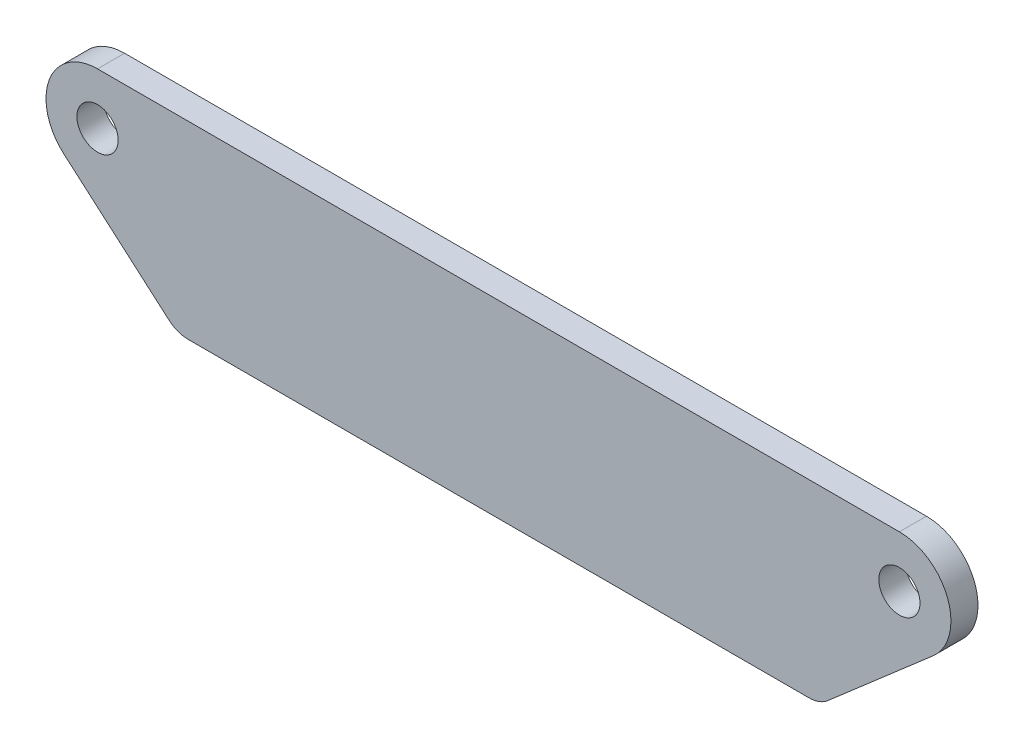
ISO-10303-21;
HEADER;
FILE_DESCRIPTION(('STEP AP214'),'2;1');
FILE_NAME('part.step','',(''),(''),'','','');
FILE_SCHEMA(('AUTOMOTIVE_DESIGN { 1 0 10303 214 1 1 1 1 }'));
ENDSEC;
DATA;
#1=APPLICATION_CONTEXT('core data for automotive mechanical design processes');
#2=APPLICATION_PROTOCOL_DEFINITION('international standard','automotive_design',2000,#1);
#3=PRODUCT_CONTEXT('',#1,'mechanical');
#4=PRODUCT('Part','Part','',(#3));
#5=PRODUCT_RELATED_PRODUCT_CATEGORY('part','',(#4));
#6=PRODUCT_DEFINITION_FORMATION('','',#4);
#7=PRODUCT_DEFINITION_CONTEXT('part definition',#1,'design');
#8=PRODUCT_DEFINITION('design','',#6,#7);
#9=PRODUCT_DEFINITION_SHAPE('','',#8);
#10=(LENGTH_UNIT() NAMED_UNIT(*) SI_UNIT(.MILLI.,.METRE.));
#11=(NAMED_UNIT(*) PLANE_ANGLE_UNIT() SI_UNIT($,.RADIAN.));
#12=(NAMED_UNIT(*) SI_UNIT($,.STERADIAN.) SOLID_ANGLE_UNIT());
#13=UNCERTAINTY_MEASURE_WITH_UNIT(LENGTH_MEASURE(1.E-05),#10,'distance_accuracy_value','');
#14=(GEOMETRIC_REPRESENTATION_CONTEXT(3) GLOBAL_UNCERTAINTY_ASSIGNED_CONTEXT((#13)) GLOBAL_UNIT_ASSIGNED_CONTEXT((#10,
#11,#12)) REPRESENTATION_CONTEXT('',''));
#15=CARTESIAN_POINT('',(0.,0.,0.));
#16=DIRECTION('',(0.,0.,1.));
#17=DIRECTION('',(1.,0.,0.));
#18=AXIS2_PLACEMENT_3D('',#15,#16,#17);
#19=CARTESIAN_POINT('',(0.,6.35,3.));
#20=DIRECTION('',(0.,0.,-1.));
#21=DIRECTION('',(-1.,0.,0.));
#22=AXIS2_PLACEMENT_3D('',#19,#20,#21);
#23=PLANE('',#22);
#24=CARTESIAN_POINT('',(0.,6.35,3.));
#25=DIRECTION('',(0.,0.,1.));
#26=DIRECTION('',(1.,0.,0.));
#27=AXIS2_PLACEMENT_3D('',#24,#25,#26);
#28=CIRCLE('',#27,2.286);
#29=CARTESIAN_POINT('',(2.286,6.35,3.));
#30=VERTEX_POINT('',#29);
#31=EDGE_CURVE('E133',#30,#30,#28,.T.);
#32=ORIENTED_EDGE('',*,*,#31,.F.);
#33=EDGE_LOOP('',(#32));
#34=FACE_BOUND('',#33,.T.);
#35=CARTESIAN_POINT('',(0.,6.35,3.));
#36=DIRECTION('',(0.,0.,1.));
#37=DIRECTION('',(-1.,0.,0.));
#38=AXIS2_PLACEMENT_3D('',#35,#36,#37);
#39=CIRCLE('',#38,5.715);
#40=CARTESIAN_POINT('',(0.,12.065,3.));
#41=VERTEX_POINT('',#40);
#42=CARTESIAN_POINT('',(-3.74746717388892,2.035175,3.));
#43=VERTEX_POINT('',#42);
#44=EDGE_CURVE('E144',#41,#43,#39,.T.);
#45=ORIENTED_EDGE('',*,*,#44,.T.);
#46=DIRECTION('',(0.755,-0.655724789831832,0.));
#47=VECTOR('',#46,1.);
#48=CARTESIAN_POINT('',(-3.74746717388892,2.035175,3.));
#49=LINE('',#48,#47);
#50=CARTESIAN_POINT('',(7.93611047759015,-8.112125,3.));
#51=VERTEX_POINT('',#50);
#52=EDGE_CURVE('E92',#43,#51,#49,.T.);
#53=ORIENTED_EDGE('',*,*,#52,.T.);
#54=CARTESIAN_POINT('',(10.0180366853062,-5.715,3.));
#55=DIRECTION('',(0.,0.,1.));
#56=DIRECTION('',(1.,0.,0.));
#57=AXIS2_PLACEMENT_3D('',#54,#55,#56);
#58=CIRCLE('',#57,3.175);
#59=CARTESIAN_POINT('',(10.0180366853062,-8.89,3.));
#60=VERTEX_POINT('',#59);
#61=EDGE_CURVE('E159',#51,#60,#58,.T.);
#62=ORIENTED_EDGE('',*,*,#61,.T.);
#63=DIRECTION('',(1.,0.,0.));
#64=VECTOR('',#63,1.);
#65=CARTESIAN_POINT('',(10.0180366853062,-8.89,3.));
#66=LINE('',#65,#64);
#67=CARTESIAN_POINT('',(78.8819633146938,-8.89,3.));
#68=VERTEX_POINT('',#67);
#69=EDGE_CURVE('E172',#60,#68,#66,.T.);
#70=ORIENTED_EDGE('',*,*,#69,.T.);
#71=CARTESIAN_POINT('',(78.8819633146938,-5.715,3.));
#72=DIRECTION('',(0.,0.,1.));
#73=DIRECTION('',(-1.,0.,0.));
#74=AXIS2_PLACEMENT_3D('',#71,#72,#73);
#75=CIRCLE('',#74,3.175);
#76=CARTESIAN_POINT('',(80.9638895224098,-8.112125,3.));
#77=VERTEX_POINT('',#76);
#78=EDGE_CURVE('E111',#68,#77,#75,.T.);
#79=ORIENTED_EDGE('',*,*,#78,.T.);
#80=DIRECTION('',(0.755,0.655724789831832,0.));
#81=VECTOR('',#80,1.);
#82=CARTESIAN_POINT('',(92.6474671738889,2.035175,3.));
#83=LINE('',#82,#81);
#84=CARTESIAN_POINT('',(92.6474671738889,2.035175,3.));
#85=VERTEX_POINT('',#84);
#86=EDGE_CURVE('E105',#77,#85,#83,.T.);
#87=ORIENTED_EDGE('',*,*,#86,.T.);
#88=CARTESIAN_POINT('',(88.9,6.35,3.));
#89=DIRECTION('',(0.,0.,1.));
#90=DIRECTION('',(-1.,0.,0.));
#91=AXIS2_PLACEMENT_3D('',#88,#89,#90);
#92=CIRCLE('',#91,5.715);
#93=CARTESIAN_POINT('',(88.9,12.065,3.));
#94=VERTEX_POINT('',#93);
#95=EDGE_CURVE('E109',#85,#94,#92,.T.);
#96=ORIENTED_EDGE('',*,*,#95,.T.);
#97=DIRECTION('',(-1.,0.,0.));
#98=VECTOR('',#97,1.);
#99=CARTESIAN_POINT('',(0.,12.065,3.));
#100=LINE('',#99,#98);
#101=EDGE_CURVE('E49',#94,#41,#100,.T.);
#102=ORIENTED_EDGE('',*,*,#101,.T.);
#103=EDGE_LOOP('',(#45,#53,#62,#70,#79,#87,#96,#102));
#104=FACE_BOUND('',#103,.T.);
#105=CARTESIAN_POINT('',(88.9,6.35,3.));
#106=DIRECTION('',(0.,0.,1.));
#107=DIRECTION('',(1.,0.,0.));
#108=AXIS2_PLACEMENT_3D('',#105,#106,#107);
#109=CIRCLE('',#108,2.28599999999999);
#110=CARTESIAN_POINT('',(91.186,6.35,3.));
#111=VERTEX_POINT('',#110);
#112=EDGE_CURVE('E181',#111,#111,#109,.T.);
#113=ORIENTED_EDGE('',*,*,#112,.F.);
#114=EDGE_LOOP('',(#113));
#115=FACE_BOUND('',#114,.T.);
#116=ADVANCED_FACE('F32',(#34,#104,#115),#23,.F.);
#117=CARTESIAN_POINT('',(0.,6.35,0.));
#118=DIRECTION('',(0.,0.,-1.));
#119=DIRECTION('',(-1.,0.,0.));
#120=AXIS2_PLACEMENT_3D('',#117,#118,#119);
#121=PLANE('',#120);
#122=CARTESIAN_POINT('',(0.,6.35,0.));
#123=DIRECTION('',(0.,0.,1.));
#124=DIRECTION('',(1.,0.,0.));
#125=AXIS2_PLACEMENT_3D('',#122,#123,#124);
#126=CIRCLE('',#125,2.286);
#127=CARTESIAN_POINT('',(2.286,6.35,0.));
#128=VERTEX_POINT('',#127);
#129=EDGE_CURVE('E178',#128,#128,#126,.T.);
#130=ORIENTED_EDGE('',*,*,#129,.T.);
#131=EDGE_LOOP('',(#130));
#132=FACE_BOUND('',#131,.T.);
#133=CARTESIAN_POINT('',(0.,6.35,0.));
#134=DIRECTION('',(0.,0.,1.));
#135=DIRECTION('',(-1.,0.,0.));
#136=AXIS2_PLACEMENT_3D('',#133,#134,#135);
#137=CIRCLE('',#136,5.715);
#138=CARTESIAN_POINT('',(0.,12.065,0.));
#139=VERTEX_POINT('',#138);
#140=CARTESIAN_POINT('',(-3.74746717388892,2.035175,0.));
#141=VERTEX_POINT('',#140);
#142=EDGE_CURVE('E129',#139,#141,#137,.T.);
#143=ORIENTED_EDGE('',*,*,#142,.F.);
#144=DIRECTION('',(-1.,0.,0.));
#145=VECTOR('',#144,1.);
#146=CARTESIAN_POINT('',(0.,12.065,0.));
#147=LINE('',#146,#145);
#148=CARTESIAN_POINT('',(88.9,12.065,0.));
#149=VERTEX_POINT('',#148);
#150=EDGE_CURVE('E84',#149,#139,#147,.T.);
#151=ORIENTED_EDGE('',*,*,#150,.F.);
#152=CARTESIAN_POINT('',(88.9,6.35,0.));
#153=DIRECTION('',(0.,0.,1.));
#154=DIRECTION('',(-1.,0.,0.));
#155=AXIS2_PLACEMENT_3D('',#152,#153,#154);
#156=CIRCLE('',#155,5.715);
#157=CARTESIAN_POINT('',(92.6474671738889,2.035175,0.));
#158=VERTEX_POINT('',#157);
#159=EDGE_CURVE('E78',#158,#149,#156,.T.);
#160=ORIENTED_EDGE('',*,*,#159,.F.);
#161=DIRECTION('',(0.755,0.655724789831832,0.));
#162=VECTOR('',#161,1.);
#163=CARTESIAN_POINT('',(92.6474671738889,2.035175,0.));
#164=LINE('',#163,#162);
#165=CARTESIAN_POINT('',(80.9638895224098,-8.112125,0.));
#166=VERTEX_POINT('',#165);
#167=EDGE_CURVE('E119',#166,#158,#164,.T.);
#168=ORIENTED_EDGE('',*,*,#167,.F.);
#169=CARTESIAN_POINT('',(78.8819633146938,-5.715,0.));
#170=DIRECTION('',(0.,0.,1.));
#171=DIRECTION('',(-1.,0.,0.));
#172=AXIS2_PLACEMENT_3D('',#169,#170,#171);
#173=CIRCLE('',#172,3.175);
#174=CARTESIAN_POINT('',(78.8819633146938,-8.89,0.));
#175=VERTEX_POINT('',#174);
#176=EDGE_CURVE('E139',#175,#166,#173,.T.);
#177=ORIENTED_EDGE('',*,*,#176,.F.);
#178=DIRECTION('',(1.,0.,0.));
#179=VECTOR('',#178,1.);
#180=CARTESIAN_POINT('',(10.0180366853062,-8.89,0.));
#181=LINE('',#180,#179);
#182=CARTESIAN_POINT('',(10.0180366853062,-8.89,0.));
#183=VERTEX_POINT('',#182);
#184=EDGE_CURVE('E137',#183,#175,#181,.T.);
#185=ORIENTED_EDGE('',*,*,#184,.F.);
#186=CARTESIAN_POINT('',(10.0180366853062,-5.715,0.));
#187=DIRECTION('',(0.,0.,1.));
#188=DIRECTION('',(1.,0.,0.));
#189=AXIS2_PLACEMENT_3D('',#186,#187,#188);
#190=CIRCLE('',#189,3.175);
#191=CARTESIAN_POINT('',(7.93611047759015,-8.112125,0.));
#192=VERTEX_POINT('',#191);
#193=EDGE_CURVE('E135',#192,#183,#190,.T.);
#194=ORIENTED_EDGE('',*,*,#193,.F.);
#195=DIRECTION('',(0.755,-0.655724789831832,0.));
#196=VECTOR('',#195,1.);
#197=CARTESIAN_POINT('',(-3.74746717388892,2.035175,0.));
#198=LINE('',#197,#196);
#199=EDGE_CURVE('E132',#141,#192,#198,.T.);
#200=ORIENTED_EDGE('',*,*,#199,.F.);
#201=EDGE_LOOP('',(#143,#151,#160,#168,#177,#185,#194,#200));
#202=FACE_BOUND('',#201,.T.);
#203=CARTESIAN_POINT('',(88.9,6.35,0.));
#204=DIRECTION('',(0.,0.,1.));
#205=DIRECTION('',(1.,0.,0.));
#206=AXIS2_PLACEMENT_3D('',#203,#204,#205);
#207=CIRCLE('',#206,2.28599999999999);
#208=CARTESIAN_POINT('',(91.186,6.35,0.));
#209=VERTEX_POINT('',#208);
#210=EDGE_CURVE('E184',#209,#209,#207,.T.);
#211=ORIENTED_EDGE('',*,*,#210,.T.);
#212=EDGE_LOOP('',(#211));
#213=FACE_BOUND('',#212,.T.);
#214=ADVANCED_FACE('F163',(#132,#202,#213),#121,.T.);
#215=CARTESIAN_POINT('',(0.,6.35,3.));
#216=DIRECTION('',(0.,0.,-1.));
#217=DIRECTION('',(-1.,0.,0.));
#218=AXIS2_PLACEMENT_3D('',#215,#216,#217);
#219=CYLINDRICAL_SURFACE('',#218,5.715);
#220=ORIENTED_EDGE('',*,*,#142,.T.);
#221=DIRECTION('',(0.,0.,-1.));
#222=VECTOR('',#221,1.);
#223=CARTESIAN_POINT('',(-3.74746717388892,2.035175,3.));
#224=LINE('',#223,#222);
#225=EDGE_CURVE('E11',#43,#141,#224,.T.);
#226=ORIENTED_EDGE('',*,*,#225,.F.);
#227=ORIENTED_EDGE('',*,*,#44,.F.);
#228=DIRECTION('',(0.,0.,-1.));
#229=VECTOR('',#228,1.);
#230=CARTESIAN_POINT('',(0.,12.065,3.));
#231=LINE('',#230,#229);
#232=EDGE_CURVE('E125',#41,#139,#231,.T.);
#233=ORIENTED_EDGE('',*,*,#232,.T.);
#234=EDGE_LOOP('',(#220,#226,#227,#233));
#235=FACE_BOUND('',#234,.T.);
#236=ADVANCED_FACE('F34',(#235),#219,.T.);
#237=CARTESIAN_POINT('',(-3.74746717388892,2.035175,3.));
#238=DIRECTION('',(0.655724789831832,0.755,0.));
#239=DIRECTION('',(-0.755,0.655724789831832,0.));
#240=AXIS2_PLACEMENT_3D('',#237,#238,#239);
#241=PLANE('',#240);
#242=ORIENTED_EDGE('',*,*,#199,.T.);
#243=DIRECTION('',(0.,0.,-1.));
#244=VECTOR('',#243,1.);
#245=CARTESIAN_POINT('',(7.93611047759015,-8.112125,3.));
#246=LINE('',#245,#244);
#247=EDGE_CURVE('E41',#51,#192,#246,.T.);
#248=ORIENTED_EDGE('',*,*,#247,.F.);
#249=ORIENTED_EDGE('',*,*,#52,.F.);
#250=ORIENTED_EDGE('',*,*,#225,.T.);
#251=EDGE_LOOP('',(#242,#248,#249,#250));
#252=FACE_BOUND('',#251,.T.);
#253=ADVANCED_FACE('F217',(#252),#241,.F.);
#254=CARTESIAN_POINT('',(10.0180366853062,-5.715,3.));
#255=DIRECTION('',(0.,0.,-1.));
#256=DIRECTION('',(-1.,0.,0.));
#257=AXIS2_PLACEMENT_3D('',#254,#255,#256);
#258=CYLINDRICAL_SURFACE('',#257,3.175);
#259=ORIENTED_EDGE('',*,*,#193,.T.);
#260=DIRECTION('',(0.,0.,-1.));
#261=VECTOR('',#260,1.);
#262=CARTESIAN_POINT('',(10.0180366853062,-8.89,3.));
#263=LINE('',#262,#261);
#264=EDGE_CURVE('E151',#60,#183,#263,.T.);
#265=ORIENTED_EDGE('',*,*,#264,.F.);
#266=ORIENTED_EDGE('',*,*,#61,.F.);
#267=ORIENTED_EDGE('',*,*,#247,.T.);
#268=EDGE_LOOP('',(#259,#265,#266,#267));
#269=FACE_BOUND('',#268,.T.);
#270=ADVANCED_FACE('F157',(#269),#258,.T.);
#271=CARTESIAN_POINT('',(10.0180366853062,-8.89,3.));
#272=DIRECTION('',(0.,1.,0.));
#273=DIRECTION('',(-1.,0.,0.));
#274=AXIS2_PLACEMENT_3D('',#271,#272,#273);
#275=PLANE('',#274);
#276=ORIENTED_EDGE('',*,*,#184,.T.);
#277=DIRECTION('',(0.,0.,-1.));
#278=VECTOR('',#277,1.);
#279=CARTESIAN_POINT('',(78.8819633146938,-8.89,3.));
#280=LINE('',#279,#278);
#281=EDGE_CURVE('E148',#68,#175,#280,.T.);
#282=ORIENTED_EDGE('',*,*,#281,.F.);
#283=ORIENTED_EDGE('',*,*,#69,.F.);
#284=ORIENTED_EDGE('',*,*,#264,.T.);
#285=EDGE_LOOP('',(#276,#282,#283,#284));
#286=FACE_BOUND('',#285,.T.);
#287=ADVANCED_FACE('F168',(#286),#275,.F.);
#288=CARTESIAN_POINT('',(78.8819633146938,-5.715,3.));
#289=DIRECTION('',(0.,0.,-1.));
#290=DIRECTION('',(-1.,0.,0.));
#291=AXIS2_PLACEMENT_3D('',#288,#289,#290);
#292=CYLINDRICAL_SURFACE('',#291,3.175);
#293=ORIENTED_EDGE('',*,*,#176,.T.);
#294=DIRECTION('',(0.,0.,-1.));
#295=VECTOR('',#294,1.);
#296=CARTESIAN_POINT('',(80.9638895224098,-8.112125,3.));
#297=LINE('',#296,#295);
#298=EDGE_CURVE('E120',#77,#166,#297,.T.);
#299=ORIENTED_EDGE('',*,*,#298,.F.);
#300=ORIENTED_EDGE('',*,*,#78,.F.);
#301=ORIENTED_EDGE('',*,*,#281,.T.);
#302=EDGE_LOOP('',(#293,#299,#300,#301));
#303=FACE_BOUND('',#302,.T.);
#304=ADVANCED_FACE('F171',(#303),#292,.T.);
#305=CARTESIAN_POINT('',(92.6474671738889,2.035175,3.));
#306=DIRECTION('',(-0.655724789831832,0.755,0.));
#307=DIRECTION('',(-0.755,-0.655724789831832,0.));
#308=AXIS2_PLACEMENT_3D('',#305,#306,#307);
#309=PLANE('',#308);
#310=ORIENTED_EDGE('',*,*,#167,.T.);
#311=DIRECTION('',(0.,0.,-1.));
#312=VECTOR('',#311,1.);
#313=CARTESIAN_POINT('',(92.6474671738889,2.035175,3.));
#314=LINE('',#313,#312);
#315=EDGE_CURVE('E116',#85,#158,#314,.T.);
#316=ORIENTED_EDGE('',*,*,#315,.F.);
#317=ORIENTED_EDGE('',*,*,#86,.F.);
#318=ORIENTED_EDGE('',*,*,#298,.T.);
#319=EDGE_LOOP('',(#310,#316,#317,#318));
#320=FACE_BOUND('',#319,.T.);
#321=ADVANCED_FACE('F117',(#320),#309,.F.);
#322=CARTESIAN_POINT('',(88.9,6.35,3.));
#323=DIRECTION('',(0.,0.,-1.));
#324=DIRECTION('',(-1.,0.,0.));
#325=AXIS2_PLACEMENT_3D('',#322,#323,#324);
#326=CYLINDRICAL_SURFACE('',#325,5.715);
#327=ORIENTED_EDGE('',*,*,#159,.T.);
#328=DIRECTION('',(0.,0.,-1.));
#329=VECTOR('',#328,1.);
#330=CARTESIAN_POINT('',(88.9,12.065,3.));
#331=LINE('',#330,#329);
#332=EDGE_CURVE('E121',#94,#149,#331,.T.);
#333=ORIENTED_EDGE('',*,*,#332,.F.);
#334=ORIENTED_EDGE('',*,*,#95,.F.);
#335=ORIENTED_EDGE('',*,*,#315,.T.);
#336=EDGE_LOOP('',(#327,#333,#334,#335));
#337=FACE_BOUND('',#336,.T.);
#338=ADVANCED_FACE('F123',(#337),#326,.T.);
#339=CARTESIAN_POINT('',(0.,12.065,3.));
#340=DIRECTION('',(0.,-1.,0.));
#341=DIRECTION('',(1.,0.,0.));
#342=AXIS2_PLACEMENT_3D('',#339,#340,#341);
#343=PLANE('',#342);
#344=ORIENTED_EDGE('',*,*,#150,.T.);
#345=ORIENTED_EDGE('',*,*,#232,.F.);
#346=ORIENTED_EDGE('',*,*,#101,.F.);
#347=ORIENTED_EDGE('',*,*,#332,.T.);
#348=EDGE_LOOP('',(#344,#345,#346,#347));
#349=FACE_BOUND('',#348,.T.);
#350=ADVANCED_FACE('F205',(#349),#343,.F.);
#351=CARTESIAN_POINT('',(0.,6.35,3.));
#352=DIRECTION('',(0.,0.,-1.));
#353=DIRECTION('',(-1.,0.,0.));
#354=AXIS2_PLACEMENT_3D('',#351,#352,#353);
#355=CYLINDRICAL_SURFACE('',#354,2.286);
#356=ORIENTED_EDGE('',*,*,#31,.T.);
#357=EDGE_LOOP('',(#356));
#358=FACE_BOUND('',#357,.T.);
#359=ORIENTED_EDGE('',*,*,#129,.F.);
#360=EDGE_LOOP('',(#359));
#361=FACE_BOUND('',#360,.T.);
#362=ADVANCED_FACE('F202',(#358,#361),#355,.F.);
#363=CARTESIAN_POINT('',(88.9,6.35,3.));
#364=DIRECTION('',(0.,0.,-1.));
#365=DIRECTION('',(-1.,0.,0.));
#366=AXIS2_PLACEMENT_3D('',#363,#364,#365);
#367=CYLINDRICAL_SURFACE('',#366,2.28599999999999);
#368=ORIENTED_EDGE('',*,*,#112,.T.);
#369=EDGE_LOOP('',(#368));
#370=FACE_BOUND('',#369,.T.);
#371=ORIENTED_EDGE('',*,*,#210,.F.);
#372=EDGE_LOOP('',(#371));
#373=FACE_BOUND('',#372,.T.);
#374=ADVANCED_FACE('F190',(#370,#373),#367,.F.);
#375=CLOSED_SHELL('',(#116,#214,#236,#253,#270,#287,#304,#321,#338,#350,#362,#374));
#376=MANIFOLD_SOLID_BREP('B2',#375);
#377=ADVANCED_BREP_SHAPE_REPRESENTATION('',(#18,#376),#14);
#378=SHAPE_DEFINITION_REPRESENTATION(#9,#377);
ENDSEC;
END-ISO-10303-21;
